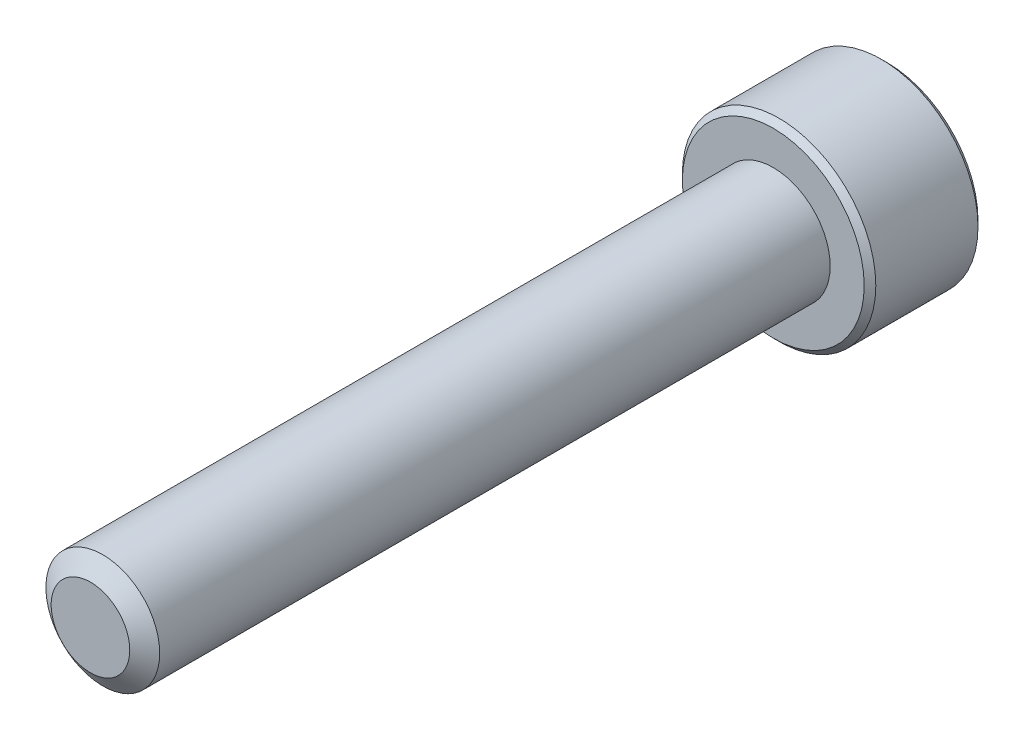
ISO-10303-21;
HEADER;
FILE_DESCRIPTION(('STEP AP214'),'2;1');
FILE_NAME('part.step','',(''),(''),'','','');
FILE_SCHEMA(('AUTOMOTIVE_DESIGN { 1 0 10303 214 1 1 1 1 }'));
ENDSEC;
DATA;
#1=APPLICATION_CONTEXT('core data for automotive mechanical design processes');
#2=APPLICATION_PROTOCOL_DEFINITION('international standard','automotive_design',2000,#1);
#3=PRODUCT_CONTEXT('',#1,'mechanical');
#4=PRODUCT('Part','Part','',(#3));
#5=PRODUCT_RELATED_PRODUCT_CATEGORY('part','',(#4));
#6=PRODUCT_DEFINITION_FORMATION('','',#4);
#7=PRODUCT_DEFINITION_CONTEXT('part definition',#1,'design');
#8=PRODUCT_DEFINITION('design','',#6,#7);
#9=PRODUCT_DEFINITION_SHAPE('','',#8);
#10=(LENGTH_UNIT() NAMED_UNIT(*) SI_UNIT(.MILLI.,.METRE.));
#11=(NAMED_UNIT(*) PLANE_ANGLE_UNIT() SI_UNIT($,.RADIAN.));
#12=(NAMED_UNIT(*) SI_UNIT($,.STERADIAN.) SOLID_ANGLE_UNIT());
#13=UNCERTAINTY_MEASURE_WITH_UNIT(LENGTH_MEASURE(1.E-05),#10,'distance_accuracy_value','');
#14=(GEOMETRIC_REPRESENTATION_CONTEXT(3) GLOBAL_UNCERTAINTY_ASSIGNED_CONTEXT((#13)) GLOBAL_UNIT_ASSIGNED_CONTEXT((#10,
#11,#12)) REPRESENTATION_CONTEXT('',''));
#15=CARTESIAN_POINT('',(0.,0.,0.));
#16=DIRECTION('',(0.,0.,1.));
#17=DIRECTION('',(1.,0.,0.));
#18=AXIS2_PLACEMENT_3D('',#15,#16,#17);
#19=CARTESIAN_POINT('',(-3.1112265541644E-12,0.,-30.));
#20=DIRECTION('',(0.,0.,1.));
#21=DIRECTION('',(1.,0.,0.));
#22=AXIS2_PLACEMENT_3D('',#19,#20,#21);
#23=CYLINDRICAL_SURFACE('',#22,2.5);
#24=CARTESIAN_POINT('',(0.,0.,-0.541691224311858));
#25=DIRECTION('',(0.,0.,1.));
#26=DIRECTION('',(1.,0.,0.));
#27=AXIS2_PLACEMENT_3D('',#24,#25,#26);
#28=CIRCLE('',#27,2.5);
#29=CARTESIAN_POINT('',(2.5,0.,-0.541691224311858));
#30=VERTEX_POINT('',#29);
#31=EDGE_CURVE('E122',#30,#30,#28,.T.);
#32=ORIENTED_EDGE('',*,*,#31,.F.);
#33=EDGE_LOOP('',(#32));
#34=FACE_BOUND('',#33,.T.);
#35=CARTESIAN_POINT('',(-3.1112265541644E-12,0.,-30.));
#36=DIRECTION('',(0.,0.,-1.));
#37=DIRECTION('',(-1.,0.,0.));
#38=AXIS2_PLACEMENT_3D('',#35,#36,#37);
#39=CIRCLE('',#38,2.5);
#40=CARTESIAN_POINT('',(-2.50000000000311,0.,-30.));
#41=VERTEX_POINT('',#40);
#42=EDGE_CURVE('E228',#41,#41,#39,.F.);
#43=ORIENTED_EDGE('',*,*,#42,.T.);
#44=EDGE_LOOP('',(#43));
#45=FACE_BOUND('',#44,.T.);
#46=ADVANCED_FACE('F48',(#34,#45),#23,.T.);
#47=CARTESIAN_POINT('',(0.,0.,0.));
#48=DIRECTION('',(0.,0.,-1.));
#49=DIRECTION('',(-1.,0.,0.));
#50=AXIS2_PLACEMENT_3D('',#47,#48,#49);
#51=CONICAL_SURFACE('',#50,1.72638475772933,0.959931088596884);
#52=ORIENTED_EDGE('',*,*,#31,.T.);
#53=EDGE_LOOP('',(#52));
#54=FACE_BOUND('',#53,.T.);
#55=CARTESIAN_POINT('',(0.,0.,0.));
#56=DIRECTION('',(0.,0.,1.));
#57=DIRECTION('',(1.,0.,0.));
#58=AXIS2_PLACEMENT_3D('',#55,#56,#57);
#59=CIRCLE('',#58,1.72638475772933);
#60=CARTESIAN_POINT('',(1.72638475772933,0.,0.));
#61=VERTEX_POINT('',#60);
#62=EDGE_CURVE('E226',#61,#61,#59,.T.);
#63=ORIENTED_EDGE('',*,*,#62,.F.);
#64=EDGE_LOOP('',(#63));
#65=FACE_BOUND('',#64,.T.);
#66=ADVANCED_FACE('F209',(#54,#65),#51,.T.);
#67=CARTESIAN_POINT('',(0.,0.,0.));
#68=DIRECTION('',(0.,0.,1.));
#69=DIRECTION('',(1.,0.,0.));
#70=AXIS2_PLACEMENT_3D('',#67,#68,#69);
#71=PLANE('',#70);
#72=ORIENTED_EDGE('',*,*,#62,.T.);
#73=EDGE_LOOP('',(#72));
#74=FACE_BOUND('',#73,.T.);
#75=ADVANCED_FACE('F206',(#74),#71,.T.);
#76=CARTESIAN_POINT('',(-3.10862446895044E-12,0.,-35.));
#77=DIRECTION('',(0.,0.,1.));
#78=DIRECTION('',(1.,0.,0.));
#79=AXIS2_PLACEMENT_3D('',#76,#77,#78);
#80=CYLINDRICAL_SURFACE('',#79,4.25);
#81=CARTESIAN_POINT('',(-3.10862446895044E-12,0.,-34.745));
#82=DIRECTION('',(0.,0.,-1.));
#83=DIRECTION('',(-1.,0.,0.));
#84=AXIS2_PLACEMENT_3D('',#81,#82,#83);
#85=CIRCLE('',#84,4.25);
#86=CARTESIAN_POINT('',(-4.25000000000311,0.,-34.745));
#87=VERTEX_POINT('',#86);
#88=EDGE_CURVE('E56',#87,#87,#85,.F.);
#89=ORIENTED_EDGE('',*,*,#88,.T.);
#90=EDGE_LOOP('',(#89));
#91=FACE_BOUND('',#90,.T.);
#92=CARTESIAN_POINT('',(-3.1112265541644E-12,0.,-30.255));
#93=DIRECTION('',(0.,0.,-1.));
#94=DIRECTION('',(-1.,0.,0.));
#95=AXIS2_PLACEMENT_3D('',#92,#93,#94);
#96=CIRCLE('',#95,4.25);
#97=CARTESIAN_POINT('',(-4.25000000000311,0.,-30.255));
#98=VERTEX_POINT('',#97);
#99=EDGE_CURVE('E185',#98,#98,#96,.T.);
#100=ORIENTED_EDGE('',*,*,#99,.T.);
#101=EDGE_LOOP('',(#100));
#102=FACE_BOUND('',#101,.T.);
#103=ADVANCED_FACE('F190',(#91,#102),#80,.T.);
#104=CARTESIAN_POINT('',(-3.10862446895044E-12,0.,-35.));
#105=DIRECTION('',(0.,0.,-1.));
#106=DIRECTION('',(-1.,0.,0.));
#107=AXIS2_PLACEMENT_3D('',#104,#105,#106);
#108=PLANE('',#107);
#109=CARTESIAN_POINT('',(-3.10862446895044E-12,0.,-35.));
#110=DIRECTION('',(0.,0.,-1.));
#111=DIRECTION('',(-1.,0.,0.));
#112=AXIS2_PLACEMENT_3D('',#109,#110,#111);
#113=CIRCLE('',#112,3.99500000000001);
#114=CARTESIAN_POINT('',(-3.99500000000311,0.,-35.));
#115=VERTEX_POINT('',#114);
#116=EDGE_CURVE('E121',#115,#115,#113,.T.);
#117=ORIENTED_EDGE('',*,*,#116,.T.);
#118=EDGE_LOOP('',(#117));
#119=FACE_BOUND('',#118,.T.);
#120=CARTESIAN_POINT('',(-3.10862446895044E-12,0.,-35.));
#121=DIRECTION('',(0.,0.,-1.));
#122=DIRECTION('',(-1.,0.,0.));
#123=AXIS2_PLACEMENT_3D('',#120,#121,#122);
#124=CIRCLE('',#123,2.3094010767585);
#125=CARTESIAN_POINT('',(-2.00000000000311,1.15470053837919,-35.));
#126=VERTEX_POINT('',#125);
#127=CARTESIAN_POINT('',(-3.1112265541644E-12,2.30940107675859,-35.));
#128=VERTEX_POINT('',#127);
#129=EDGE_CURVE('E102',#126,#128,#124,.T.);
#130=ORIENTED_EDGE('',*,*,#129,.F.);
#131=CARTESIAN_POINT('',(-2.00000000000311,-1.15470053837918,-35.));
#132=VERTEX_POINT('',#131);
#133=EDGE_CURVE('E62',#132,#126,#124,.T.);
#134=ORIENTED_EDGE('',*,*,#133,.F.);
#135=CARTESIAN_POINT('',(-3.10862446895044E-12,-2.30940107675859,-35.));
#136=VERTEX_POINT('',#135);
#137=EDGE_CURVE('E288',#136,#132,#124,.T.);
#138=ORIENTED_EDGE('',*,*,#137,.F.);
#139=CARTESIAN_POINT('',(1.99999999999689,-1.15470053837918,-35.));
#140=VERTEX_POINT('',#139);
#141=EDGE_CURVE('E69',#140,#136,#124,.T.);
#142=ORIENTED_EDGE('',*,*,#141,.F.);
#143=CARTESIAN_POINT('',(1.99999999999689,1.15470053837918,-35.));
#144=VERTEX_POINT('',#143);
#145=EDGE_CURVE('E143',#144,#140,#124,.T.);
#146=ORIENTED_EDGE('',*,*,#145,.F.);
#147=EDGE_CURVE('E111',#128,#144,#124,.T.);
#148=ORIENTED_EDGE('',*,*,#147,.F.);
#149=EDGE_LOOP('',(#130,#134,#138,#142,#146,#148));
#150=FACE_BOUND('',#149,.T.);
#151=ADVANCED_FACE('F142',(#119,#150),#108,.T.);
#152=CARTESIAN_POINT('',(-3.1112265541644E-12,0.,-30.));
#153=DIRECTION('',(0.,0.,-1.));
#154=DIRECTION('',(-1.,0.,0.));
#155=AXIS2_PLACEMENT_3D('',#152,#153,#154);
#156=PLANE('',#155);
#157=CARTESIAN_POINT('',(-3.1112265541644E-12,0.,-30.));
#158=DIRECTION('',(0.,0.,-1.));
#159=DIRECTION('',(-1.,0.,0.));
#160=AXIS2_PLACEMENT_3D('',#157,#158,#159);
#161=CIRCLE('',#160,3.995);
#162=CARTESIAN_POINT('',(-3.99500000000311,0.,-30.));
#163=VERTEX_POINT('',#162);
#164=EDGE_CURVE('E13',#163,#163,#161,.F.);
#165=ORIENTED_EDGE('',*,*,#164,.T.);
#166=EDGE_LOOP('',(#165));
#167=FACE_BOUND('',#166,.T.);
#168=ORIENTED_EDGE('',*,*,#42,.F.);
#169=EDGE_LOOP('',(#168));
#170=FACE_BOUND('',#169,.T.);
#171=ADVANCED_FACE('F199',(#167,#170),#156,.F.);
#172=CARTESIAN_POINT('',(-3.10862446895044E-12,0.,-35.));
#173=DIRECTION('',(0.,0.,-1.));
#174=DIRECTION('',(-1.,0.,0.));
#175=AXIS2_PLACEMENT_3D('',#172,#173,#174);
#176=CONICAL_SURFACE('',#175,2.3094010767585,0.78539816339745);
#177=ORIENTED_EDGE('',*,*,#147,.T.);
#178=CARTESIAN_POINT('',(-0.000200000003116978,2.30951654681233,-35.0001154787137));
#179=CARTESIAN_POINT('',(0.0685530340276287,2.26982196410715,-34.9604530902256));
#180=CARTESIAN_POINT('',(0.138455742132447,2.22946361676577,-34.9231199822842));
#181=CARTESIAN_POINT('',(0.280995244547385,2.14716839667636,-34.8547636851362));
#182=CARTESIAN_POINT('',(0.353645597562306,2.10522369580646,-34.8237785337373));
#183=CARTESIAN_POINT('',(0.500141601050941,2.02064418875711,-34.7707002165442));
#184=CARTESIAN_POINT('',(0.573949935243285,1.97803092714276,-34.7484736271767));
#185=CARTESIAN_POINT('',(0.723191631832215,1.89186619344273,-34.7142288166751));
#186=CARTESIAN_POINT('',(0.798620433915042,1.84831735425541,-34.7021850291441));
#187=CARTESIAN_POINT('',(0.928615500667985,1.77326466747232,-34.6913185119056));
#188=CARTESIAN_POINT('',(0.983013783967055,1.74185780396626,-34.68970975361));
#189=CARTESIAN_POINT('',(1.09172145551666,1.6790954005342,-34.6924188775988));
#190=CARTESIAN_POINT('',(1.14603080591829,1.64773988246027,-34.696738837758));
#191=CARTESIAN_POINT('',(1.25413672758627,1.58532489948425,-34.71105956741));
#192=CARTESIAN_POINT('',(1.30793265655172,1.55426580541475,-34.7210666927621));
#193=CARTESIAN_POINT('',(1.4145942623025,1.49268469862235,-34.7462124302497));
#194=CARTESIAN_POINT('',(1.46746001006764,1.46216264491925,-34.7613506490423));
#195=CARTESIAN_POINT('',(1.60287973308677,1.38397803138057,-34.8062945034292));
#196=CARTESIAN_POINT('',(1.68459383484639,1.33680037273304,-34.8394888394258));
#197=CARTESIAN_POINT('',(1.80474703725472,1.2674298889786,-34.8955258231714));
#198=CARTESIAN_POINT('',(1.84434285210609,1.24456923461538,-34.915214702947));
#199=CARTESIAN_POINT('',(1.92280095888479,1.19927142554659,-34.9563873183649));
#200=CARTESIAN_POINT('',(1.96166368359065,1.1768340209762,-34.9778699516513));
#201=CARTESIAN_POINT('',(2.0001999999969,1.15458506832544,-35.0001154787137));
#202=B_SPLINE_CURVE_WITH_KNOTS('',3,(#178,#179,#180,#181,#182,#183,#184,#185,#186,#187,#188,
#189,#190,#191,#192,#193,#194,#195,#196,#197,#198,#199,#200,#201),.UNSPECIFIED.,.F.,.F.,(4,2,2,
2,2,2,2,2,2,2,2,4),(0.,0.266420613771073,0.534393751523417,0.798110374376957,1.06116288956941,
1.24939906803724,1.43770123566248,1.62621426093931,1.8147128383191,2.11415604834142,
2.26347170717788,2.41269626969768),.UNSPECIFIED.);
#203=EDGE_CURVE('E116',#128,#144,#202,.T.);
#204=ORIENTED_EDGE('',*,*,#203,.F.);
#205=EDGE_LOOP('',(#177,#204));
#206=FACE_BOUND('',#205,.T.);
#207=ADVANCED_FACE('F117',(#206),#176,.F.);
#208=ORIENTED_EDGE('',*,*,#145,.T.);
#209=CARTESIAN_POINT('',(1.99999999999689,-2.3029441729292,-35.7407713550277));
#210=CARTESIAN_POINT('',(1.99999999999689,-2.24687002663711,-35.698443273626));
#211=CARTESIAN_POINT('',(1.99999999999689,-2.19048190536959,-35.6565251568643));
#212=CARTESIAN_POINT('',(1.99999999999689,-2.07695390496425,-35.573690417861));
#213=CARTESIAN_POINT('',(1.99999999999689,-2.01981384066455,-35.5327740496681));
#214=CARTESIAN_POINT('',(1.99999999999689,-1.90424016804777,-35.4518334520186));
#215=CARTESIAN_POINT('',(1.99999999999689,-1.84579996743912,-35.4118185915599));
#216=CARTESIAN_POINT('',(1.99999999999689,-1.72792745461763,-35.3332889936643));
#217=CARTESIAN_POINT('',(1.99999999999689,-1.66849521292327,-35.2947741502431));
#218=CARTESIAN_POINT('',(1.99999999999689,-1.48162995710024,-35.1776406516043));
#219=CARTESIAN_POINT('',(1.99999999999689,-1.3522031816354,-35.1021459017296));
#220=CARTESIAN_POINT('',(1.99999999999689,-1.0868952159293,-34.9640493509944));
#221=CARTESIAN_POINT('',(1.99999999999689,-0.951037763938266,-34.9014040859035));
#222=CARTESIAN_POINT('',(1.99999999999689,-0.747111912259486,-34.8247635438751));
#223=CARTESIAN_POINT('',(1.99999999999689,-0.682064034147949,-34.8027671799191));
#224=CARTESIAN_POINT('',(1.99999999999689,-0.55039810329482,-34.7639966876601));
#225=CARTESIAN_POINT('',(1.99999999999689,-0.483779942722543,-34.7472229191212));
#226=CARTESIAN_POINT('',(1.99999999999689,-0.35048432884772,-34.7200482578844));
#227=CARTESIAN_POINT('',(1.99999999999689,-0.283829489364849,-34.7095381767417));
#228=CARTESIAN_POINT('',(1.99999999999689,-0.149806987139437,-34.6950960855449));
#229=CARTESIAN_POINT('',(1.99999999999689,-0.0824394489341806,-34.6911629447331));
#230=CARTESIAN_POINT('',(1.99999999999689,0.0499055622944297,-34.6901664769337));
#231=CARTESIAN_POINT('',(1.99999999999689,0.114881285143109,-34.6928596448504));
#232=CARTESIAN_POINT('',(1.99999999999689,0.24427592148269,-34.7044300704227));
#233=CARTESIAN_POINT('',(1.99999999999689,0.308694780266678,-34.7133079288332));
#234=CARTESIAN_POINT('',(1.99999999999689,0.437599788610625,-34.7369136592961));
#235=CARTESIAN_POINT('',(1.99999999999689,0.502067428644516,-34.7517410834465));
#236=CARTESIAN_POINT('',(1.99999999999689,0.629594322598215,-34.7864578836279));
#237=CARTESIAN_POINT('',(1.99999999999689,0.692653693883047,-34.8063468361063));
#238=CARTESIAN_POINT('',(1.99999999999689,0.89118788921044,-34.8764469792562));
#239=CARTESIAN_POINT('',(1.99999999999689,1.023835457073,-34.9346418003215));
#240=CARTESIAN_POINT('',(1.99999999999689,1.28290932150071,-35.0640305754595));
#241=CARTESIAN_POINT('',(1.99999999999689,1.40931112587568,-35.1352712314148));
#242=CARTESIAN_POINT('',(1.99999999999689,1.59200441438961,-35.2464419918747));
#243=CARTESIAN_POINT('',(1.99999999999689,1.65027549026189,-35.2831821903373));
#244=CARTESIAN_POINT('',(1.99999999999689,1.76581760389241,-35.3582145141837));
#245=CARTESIAN_POINT('',(1.99999999999689,1.82308856543103,-35.396506757118));
#246=CARTESIAN_POINT('',(1.99999999999689,1.93629654762083,-35.4740422640812));
#247=CARTESIAN_POINT('',(1.99999999999689,1.99224062500538,-35.5132752761335));
#248=CARTESIAN_POINT('',(1.99999999999689,2.103364240299,-35.5927788307365));
#249=CARTESIAN_POINT('',(1.99999999999689,2.15854398422468,-35.6330490850006));
#250=CARTESIAN_POINT('',(1.99999999999689,2.21340370692658,-35.673744238146));
#251=B_SPLINE_CURVE_WITH_KNOTS('',3,(#209,#210,#211,#212,#213,#214,#215,#216,#217,#218,#219,
#220,#221,#222,#223,#224,#225,#226,#227,#228,#229,#230,#231,#232,#233,#234,#235,#236,#237,#238,
#239,#240,#241,#242,#243,#244,#245,#246,#247,#248,#249,#250),.UNSPECIFIED.,.F.,.F.,(4,2,2,2,2,2,
2,2,2,2,2,2,2,2,2,2,2,2,2,2,4),(0.,0.210772731976881,0.421598374658567,0.634057554623456,
0.846501695870126,1.29562155455618,1.74319622821637,1.949020621102,2.15485918928318,
2.35699582502629,2.55909770432134,2.75388435553549,2.94868993014806,3.14690093452576,
3.34509535789692,3.77838155837647,4.21325029921621,4.41989056685643,4.62654651460918,
4.83152377111288,5.03644465914085),.UNSPECIFIED.);
#252=EDGE_CURVE('E110',#144,#140,#251,.F.);
#253=ORIENTED_EDGE('',*,*,#252,.F.);
#254=EDGE_LOOP('',(#208,#253));
#255=FACE_BOUND('',#254,.T.);
#256=ADVANCED_FACE('F294',(#255),#176,.F.);
#257=ORIENTED_EDGE('',*,*,#141,.T.);
#258=CARTESIAN_POINT('',(2.0001999999969,-1.15458506832544,-35.0001154787137));
#259=CARTESIAN_POINT('',(1.93144696596617,-1.19427965103061,-34.9604530902255));
#260=CARTESIAN_POINT('',(1.86154425786135,-1.23463799837199,-34.9231199822841));
#261=CARTESIAN_POINT('',(1.71900475544642,-1.3169332184614,-34.8547636851361));
#262=CARTESIAN_POINT('',(1.6463544024315,-1.3588779193313,-34.8237785337371));
#263=CARTESIAN_POINT('',(1.49985839894287,-1.44345742638064,-34.7707002165441));
#264=CARTESIAN_POINT('',(1.42605006475053,-1.48607068799498,-34.7484736271765));
#265=CARTESIAN_POINT('',(1.27680836816159,-1.57223542169503,-34.714228816675));
#266=CARTESIAN_POINT('',(1.20137956607875,-1.61578426088235,-34.7021850291442));
#267=CARTESIAN_POINT('',(1.0713844993258,-1.69083694766545,-34.6913185119056));
#268=CARTESIAN_POINT('',(1.01698621602673,-1.72224381117151,-34.6897097536099));
#269=CARTESIAN_POINT('',(0.908278544477123,-1.78500621460357,-34.6924188775986));
#270=CARTESIAN_POINT('',(0.8539691940755,-1.81636173267749,-34.6967388377579));
#271=CARTESIAN_POINT('',(0.745863272407523,-1.87877671565351,-34.7110595674098));
#272=CARTESIAN_POINT('',(0.692067343442069,-1.90983580972301,-34.7210666927619));
#273=CARTESIAN_POINT('',(0.585405737691313,-1.97141691651541,-34.7462124302496));
#274=CARTESIAN_POINT('',(0.532539989926198,-2.00193897021852,-34.7613506490422));
#275=CARTESIAN_POINT('',(0.397120266907072,-2.08012358375721,-34.8062945034292));
#276=CARTESIAN_POINT('',(0.315406165147396,-2.12730124240473,-34.8394888394258));
#277=CARTESIAN_POINT('',(0.195252962739043,-2.19667172615918,-34.8955258231713));
#278=CARTESIAN_POINT('',(0.155657147887665,-2.2195323805224,-34.9152147029469));
#279=CARTESIAN_POINT('',(0.0771990411089778,-2.2648301895912,-34.9563873183648));
#280=CARTESIAN_POINT('',(0.0383363164031208,-2.28726759416158,-34.9778699516512));
#281=CARTESIAN_POINT('',(-0.000200000003114376,-2.30951654681233,-35.0001154787137));
#282=B_SPLINE_CURVE_WITH_KNOTS('',3,(#258,#259,#260,#261,#262,#263,#264,#265,#266,#267,#268,
#269,#270,#271,#272,#273,#274,#275,#276,#277,#278,#279,#280,#281),.UNSPECIFIED.,.F.,.F.,(4,2,2,
2,2,2,2,2,2,2,2,4),(0.,0.266420613771111,0.534393751523434,0.798110374376966,1.06116288956945,
1.24939906803728,1.43770123566251,1.62621426093932,1.81471283831912,2.11415604834147,
2.26347170717794,2.41269626969776),.UNSPECIFIED.);
#283=EDGE_CURVE('E153',#140,#136,#282,.T.);
#284=ORIENTED_EDGE('',*,*,#283,.F.);
#285=EDGE_LOOP('',(#257,#284));
#286=FACE_BOUND('',#285,.T.);
#287=ADVANCED_FACE('F291',(#286),#176,.F.);
#288=ORIENTED_EDGE('',*,*,#137,.T.);
#289=CARTESIAN_POINT('',(0.000199999996897127,-2.30951654681233,-35.0001154787137));
#290=CARTESIAN_POINT('',(-0.0685530340338496,-2.26982196410715,-34.9604530902256));
#291=CARTESIAN_POINT('',(-0.138455742138667,-2.22946361676577,-34.9231199822842));
#292=CARTESIAN_POINT('',(-0.280995244553601,-2.14716839667636,-34.8547636851362));
#293=CARTESIAN_POINT('',(-0.353645597568521,-2.10522369580646,-34.8237785337373));
#294=CARTESIAN_POINT('',(-0.500141601057155,-2.02064418875712,-34.7707002165442));
#295=CARTESIAN_POINT('',(-0.573949935249501,-1.97803092714277,-34.7484736271767));
#296=CARTESIAN_POINT('',(-0.723191631838432,-1.89186619344273,-34.7142288166751));
#297=CARTESIAN_POINT('',(-0.798620433921257,-1.84831735425541,-34.7021850291441));
#298=CARTESIAN_POINT('',(-0.928615500674207,-1.77326466747232,-34.6913185119056));
#299=CARTESIAN_POINT('',(-0.983013783973283,-1.74185780396626,-34.68970975361));
#300=CARTESIAN_POINT('',(-1.0917214555229,-1.67909540053419,-34.6924188775988));
#301=CARTESIAN_POINT('',(-1.14603080592452,-1.64773988246025,-34.696738837758));
#302=CARTESIAN_POINT('',(-1.25413672759252,-1.58532489948425,-34.71105956741));
#303=CARTESIAN_POINT('',(-1.30793265655799,-1.55426580541477,-34.7210666927621));
#304=CARTESIAN_POINT('',(-1.41459426230873,-1.49268469862229,-34.7462124302497));
#305=CARTESIAN_POINT('',(-1.46746001007381,-1.46216264491907,-34.7613506490423));
#306=CARTESIAN_POINT('',(-1.6028797330929,-1.38397803138033,-34.8062945034292));
#307=CARTESIAN_POINT('',(-1.68459383485261,-1.33680037273298,-34.8394888394258));
#308=CARTESIAN_POINT('',(-1.80474703726096,-1.26742988897862,-34.8955258231714));
#309=CARTESIAN_POINT('',(-1.84434285211233,-1.24456923461539,-34.915214702947));
#310=CARTESIAN_POINT('',(-1.92280095889101,-1.19927142554657,-34.9563873183649));
#311=CARTESIAN_POINT('',(-1.96166368359686,-1.17683402097617,-34.9778699516513));
#312=CARTESIAN_POINT('',(-2.00020000000312,-1.15458506832544,-35.0001154787137));
#313=B_SPLINE_CURVE_WITH_KNOTS('',3,(#289,#290,#291,#292,#293,#294,#295,#296,#297,#298,#299,
#300,#301,#302,#303,#304,#305,#306,#307,#308,#309,#310,#311,#312),.UNSPECIFIED.,.F.,.F.,(4,2,2,
2,2,2,2,2,2,2,2,4),(0.,0.266420613771067,0.534393751523411,0.798110374376953,1.06116288956941,
1.24939906803726,1.43770123566251,1.62621426093935,1.81471283831915,2.11415604834144,
2.26347170717789,2.41269626969769),.UNSPECIFIED.);
#314=EDGE_CURVE('E265',#136,#132,#313,.T.);
#315=ORIENTED_EDGE('',*,*,#314,.F.);
#316=EDGE_LOOP('',(#288,#315));
#317=FACE_BOUND('',#316,.T.);
#318=ADVANCED_FACE('F290',(#317),#176,.F.);
#319=ORIENTED_EDGE('',*,*,#133,.T.);
#320=CARTESIAN_POINT('',(-2.00000000000311,-2.30294417326426,-35.7407713552807));
#321=CARTESIAN_POINT('',(-2.00000000000311,-2.24687002696276,-35.6984432738692));
#322=CARTESIAN_POINT('',(-2.00000000000311,-2.19048190568581,-35.6565251570978));
#323=CARTESIAN_POINT('',(-2.00000000000311,-2.07695390526151,-35.5736904180751));
#324=CARTESIAN_POINT('',(-2.00000000000311,-2.01981384095228,-35.5327740498725));
#325=CARTESIAN_POINT('',(-2.00000000000311,-1.90424016831613,-35.4518334522036));
#326=CARTESIAN_POINT('',(-2.00000000000311,-1.84579996769762,-35.4118185917351));
#327=CARTESIAN_POINT('',(-2.00000000000311,-1.72792745485625,-35.3332889938202));
#328=CARTESIAN_POINT('',(-2.00000000000311,-1.66849521315186,-35.2947741503895));
#329=CARTESIAN_POINT('',(-2.00000000000311,-1.48162995729575,-35.1776406517203));
#330=CARTESIAN_POINT('',(-2.00000000000311,-1.35220318180739,-35.1021459018253));
#331=CARTESIAN_POINT('',(-2.00000000000311,-1.08689521605224,-34.9640493510523));
#332=CARTESIAN_POINT('',(-2.00000000000311,-0.951037764035688,-34.901404085944));
#333=CARTESIAN_POINT('',(-2.00000000000311,-0.747111912337722,-34.8247635439028));
#334=CARTESIAN_POINT('',(-2.00000000000311,-0.682064034234229,-34.8027671799472));
#335=CARTESIAN_POINT('',(-2.00000000000311,-0.550398103397449,-34.7639966876876));
#336=CARTESIAN_POINT('',(-2.00000000000311,-0.483779942833476,-34.7472229191476));
#337=CARTESIAN_POINT('',(-2.00000000000311,-0.350484328974988,-34.7200482579067));
#338=CARTESIAN_POINT('',(-2.00000000000311,-0.283829489500144,-34.709538176761));
#339=CARTESIAN_POINT('',(-2.00000000000311,-0.149806987290515,-34.6950960855565));
#340=CARTESIAN_POINT('',(-2.00000000000311,-0.0824394490930139,-34.6911629447399));
#341=CARTESIAN_POINT('',(-2.00000000000311,0.0499055621213036,-34.6901664769296));
#342=CARTESIAN_POINT('',(-2.00000000000311,0.114881284963426,-34.6928596448403));
#343=CARTESIAN_POINT('',(-2.00000000000311,0.244275921290551,-34.7044300703995));
#344=CARTESIAN_POINT('',(-2.00000000000311,0.308694780068641,-34.7133079288031));
#345=CARTESIAN_POINT('',(-2.00000000000311,0.437599788400937,-34.7369136592514));
#346=CARTESIAN_POINT('',(-2.00000000000311,0.502067428429092,-34.7517410833941));
#347=CARTESIAN_POINT('',(-2.00000000000311,0.629594322371892,-34.78645788356));
#348=CARTESIAN_POINT('',(-2.00000000000311,0.69265369365156,-34.8063468360305));
#349=CARTESIAN_POINT('',(-2.00000000000311,0.891187888928516,-34.8764469791434));
#350=CARTESIAN_POINT('',(-2.00000000000311,1.02383545674829,-34.9346418001746));
#351=CARTESIAN_POINT('',(-2.00000000000311,1.28290932109378,-35.0640305752408));
#352=CARTESIAN_POINT('',(-2.00000000000311,1.40931112542931,-35.1352712311583));
#353=CARTESIAN_POINT('',(-2.00000000000311,1.59200441388852,-35.2464419915627));
#354=CARTESIAN_POINT('',(-2.00000000000311,1.65027548974479,-35.2831821900083));
#355=CARTESIAN_POINT('',(-2.00000000000311,1.76581760334351,-35.3582145138205));
#356=CARTESIAN_POINT('',(-2.00000000000311,1.82308856486635,-35.3965067567376));
#357=CARTESIAN_POINT('',(-2.00000000000311,1.93629654702497,-35.4740422636668));
#358=CARTESIAN_POINT('',(-2.00000000000311,1.99224062439411,-35.5132752757022));
#359=CARTESIAN_POINT('',(-2.00000000000311,2.10336423965701,-35.5927788302713));
#360=CARTESIAN_POINT('',(-2.00000000000311,2.15854398356739,-35.6330490845184));
#361=CARTESIAN_POINT('',(-2.00000000000311,2.21340370625401,-35.6737442376469));
#362=B_SPLINE_CURVE_WITH_KNOTS('',3,(#320,#321,#322,#323,#324,#325,#326,#327,#328,#329,#330,
#331,#332,#333,#334,#335,#336,#337,#338,#339,#340,#341,#342,#343,#344,#345,#346,#347,#348,#349,
#350,#351,#352,#353,#354,#355,#356,#357,#358,#359,#360,#361),.UNSPECIFIED.,.F.,.F.,(4,2,2,2,2,2,
2,2,2,2,2,2,2,2,2,2,2,2,2,2,4),(0.,0.210772732017002,0.421598374738827,0.634057554744603,
0.846501696032152,1.29562155480986,1.74319622856086,1.94902062142324,2.15485918958121,
2.35699582530205,2.55909770457484,2.75388435576867,2.9486899303609,3.14690093471669,
3.34509535806595,3.7783815583877,4.21325029906862,4.41989056664092,4.62654651432573,
4.83152377076241,5.03644465872337),.UNSPECIFIED.);
#363=EDGE_CURVE('E132',#132,#126,#362,.T.);
#364=ORIENTED_EDGE('',*,*,#363,.F.);
#365=EDGE_LOOP('',(#319,#364));
#366=FACE_BOUND('',#365,.T.);
#367=ADVANCED_FACE('F303',(#366),#176,.F.);
#368=ORIENTED_EDGE('',*,*,#129,.T.);
#369=CARTESIAN_POINT('',(-2.00020000000312,1.15458506832545,-35.0001154787137));
#370=CARTESIAN_POINT('',(-1.93144696597239,1.19427965103062,-34.9604530902255));
#371=CARTESIAN_POINT('',(-1.86154425786757,1.234637998372,-34.9231199822841));
#372=CARTESIAN_POINT('',(-1.71900475545264,1.31693321846141,-34.8547636851361));
#373=CARTESIAN_POINT('',(-1.64635440243772,1.3588779193313,-34.8237785337372));
#374=CARTESIAN_POINT('',(-1.4998583989491,1.44345742638064,-34.7707002165441));
#375=CARTESIAN_POINT('',(-1.42605006475676,1.48607068799499,-34.7484736271765));
#376=CARTESIAN_POINT('',(-1.27680836816782,1.57223542169503,-34.714228816675));
#377=CARTESIAN_POINT('',(-1.20137956608497,1.61578426088234,-34.7021850291442));
#378=CARTESIAN_POINT('',(-1.07138449933201,1.69083694766544,-34.6913185119056));
#379=CARTESIAN_POINT('',(-1.01698621603294,1.72224381117151,-34.6897097536099));
#380=CARTESIAN_POINT('',(-0.908278544483336,1.78500621460359,-34.6924188775986));
#381=CARTESIAN_POINT('',(-0.853969194081706,1.8163617326775,-34.6967388377579));
#382=CARTESIAN_POINT('',(-0.745863272413724,1.87877671565353,-34.7110595674098));
#383=CARTESIAN_POINT('',(-0.692067343448272,1.90983580972304,-34.7210666927619));
#384=CARTESIAN_POINT('',(-0.585405737697499,1.97141691651543,-34.7462124302496));
#385=CARTESIAN_POINT('',(-0.532539989932367,2.00193897021852,-34.7613506490422));
#386=CARTESIAN_POINT('',(-0.397120266913237,2.08012358375719,-34.8062945034292));
#387=CARTESIAN_POINT('',(-0.315406165153589,2.12730124240474,-34.8394888394258));
#388=CARTESIAN_POINT('',(-0.195252962745253,2.19667172615919,-34.8955258231713));
#389=CARTESIAN_POINT('',(-0.155657147893877,2.21953238052241,-34.9152147029469));
#390=CARTESIAN_POINT('',(-0.0771990411151923,2.2648301895912,-34.9563873183648));
#391=CARTESIAN_POINT('',(-0.0383363164093364,2.28726759416158,-34.9778699516512));
#392=CARTESIAN_POINT('',(0.000199999996894525,2.30951654681233,-35.0001154787137));
#393=B_SPLINE_CURVE_WITH_KNOTS('',3,(#369,#370,#371,#372,#373,#374,#375,#376,#377,#378,#379,
#380,#381,#382,#383,#384,#385,#386,#387,#388,#389,#390,#391,#392),.UNSPECIFIED.,.F.,.F.,(4,2,2,
2,2,2,2,2,2,2,2,4),(0.,0.266420613771103,0.534393751523425,0.798110374376956,1.06116288956943,
1.24939906803728,1.43770123566253,1.62621426093935,1.81471283831916,2.11415604834149,
2.26347170717794,2.41269626969775),.UNSPECIFIED.);
#394=EDGE_CURVE('E106',#126,#128,#393,.T.);
#395=ORIENTED_EDGE('',*,*,#394,.F.);
#396=EDGE_LOOP('',(#368,#395));
#397=FACE_BOUND('',#396,.T.);
#398=ADVANCED_FACE('F104',(#397),#176,.F.);
#399=CARTESIAN_POINT('',(1.99999999999689,3.46410161513777,-32.));
#400=DIRECTION('',(0.,0.,-1.));
#401=DIRECTION('',(-1.,0.,0.));
#402=AXIS2_PLACEMENT_3D('',#399,#400,#401);
#403=PLANE('',#402);
#404=DIRECTION('',(0.866025403784439,0.5,0.));
#405=VECTOR('',#404,1.);
#406=CARTESIAN_POINT('',(-2.00000000000311,1.15470053837919,-32.));
#407=LINE('',#406,#405);
#408=CARTESIAN_POINT('',(-2.00000000000311,1.15470053837919,-32.));
#409=VERTEX_POINT('',#408);
#410=CARTESIAN_POINT('',(-3.1112265541644E-12,2.30940107675859,-32.));
#411=VERTEX_POINT('',#410);
#412=EDGE_CURVE('E131',#409,#411,#407,.T.);
#413=ORIENTED_EDGE('',*,*,#412,.T.);
#414=DIRECTION('',(0.866025403784439,-0.5,0.));
#415=VECTOR('',#414,1.);
#416=CARTESIAN_POINT('',(-3.1112265541644E-12,2.30940107675859,-32.));
#417=LINE('',#416,#415);
#418=CARTESIAN_POINT('',(1.99999999999689,1.15470053837918,-32.));
#419=VERTEX_POINT('',#418);
#420=EDGE_CURVE('E136',#411,#419,#417,.T.);
#421=ORIENTED_EDGE('',*,*,#420,.T.);
#422=DIRECTION('',(0.,-1.,0.));
#423=VECTOR('',#422,1.);
#424=CARTESIAN_POINT('',(1.99999999999689,1.15470053837918,-32.));
#425=LINE('',#424,#423);
#426=CARTESIAN_POINT('',(1.99999999999689,-1.15470053837918,-32.));
#427=VERTEX_POINT('',#426);
#428=EDGE_CURVE('E251',#419,#427,#425,.T.);
#429=ORIENTED_EDGE('',*,*,#428,.T.);
#430=DIRECTION('',(-0.866025403784439,-0.5,0.));
#431=VECTOR('',#430,1.);
#432=CARTESIAN_POINT('',(1.99999999999689,-1.15470053837918,-32.));
#433=LINE('',#432,#431);
#434=CARTESIAN_POINT('',(-3.10862446895044E-12,-2.30940107675859,-32.));
#435=VERTEX_POINT('',#434);
#436=EDGE_CURVE('E248',#427,#435,#433,.T.);
#437=ORIENTED_EDGE('',*,*,#436,.T.);
#438=DIRECTION('',(-0.866025403784439,0.5,0.));
#439=VECTOR('',#438,1.);
#440=CARTESIAN_POINT('',(-3.10862446895044E-12,-2.30940107675859,-32.));
#441=LINE('',#440,#439);
#442=CARTESIAN_POINT('',(-2.00000000000311,-1.15470053837918,-32.));
#443=VERTEX_POINT('',#442);
#444=EDGE_CURVE('E245',#435,#443,#441,.T.);
#445=ORIENTED_EDGE('',*,*,#444,.T.);
#446=DIRECTION('',(0.,1.,0.));
#447=VECTOR('',#446,1.);
#448=CARTESIAN_POINT('',(-2.00000000000311,-1.15470053837918,-32.));
#449=LINE('',#448,#447);
#450=EDGE_CURVE('E139',#443,#409,#449,.T.);
#451=ORIENTED_EDGE('',*,*,#450,.T.);
#452=EDGE_LOOP('',(#413,#421,#429,#437,#445,#451));
#453=FACE_BOUND('',#452,.T.);
#454=ADVANCED_FACE('F173',(#453),#403,.T.);
#455=CARTESIAN_POINT('',(-3.1112265541644E-12,2.30940107675859,-32.));
#456=DIRECTION('',(0.5,0.866025403784439,0.));
#457=DIRECTION('',(-0.866025403784439,0.5,0.));
#458=AXIS2_PLACEMENT_3D('',#455,#456,#457);
#459=PLANE('',#458);
#460=DIRECTION('',(0.,0.,-1.));
#461=VECTOR('',#460,1.);
#462=CARTESIAN_POINT('',(-3.1112265541644E-12,2.30940107675859,-32.));
#463=LINE('',#462,#461);
#464=EDGE_CURVE('E128',#411,#128,#463,.T.);
#465=ORIENTED_EDGE('',*,*,#464,.T.);
#466=ORIENTED_EDGE('',*,*,#203,.T.);
#467=DIRECTION('',(0.,0.,-1.));
#468=VECTOR('',#467,1.);
#469=CARTESIAN_POINT('',(1.99999999999689,1.15470053837918,-32.));
#470=LINE('',#469,#468);
#471=EDGE_CURVE('E138',#419,#144,#470,.T.);
#472=ORIENTED_EDGE('',*,*,#471,.F.);
#473=ORIENTED_EDGE('',*,*,#420,.F.);
#474=EDGE_LOOP('',(#465,#466,#472,#473));
#475=FACE_BOUND('',#474,.T.);
#476=ADVANCED_FACE('F134',(#475),#459,.F.);
#477=CARTESIAN_POINT('',(1.99999999999689,1.15470053837918,-32.));
#478=DIRECTION('',(1.,0.,0.));
#479=DIRECTION('',(0.,0.,-1.));
#480=AXIS2_PLACEMENT_3D('',#477,#478,#479);
#481=PLANE('',#480);
#482=ORIENTED_EDGE('',*,*,#471,.T.);
#483=ORIENTED_EDGE('',*,*,#252,.T.);
#484=DIRECTION('',(0.,0.,-1.));
#485=VECTOR('',#484,1.);
#486=CARTESIAN_POINT('',(1.99999999999689,-1.15470053837918,-32.));
#487=LINE('',#486,#485);
#488=EDGE_CURVE('E234',#427,#140,#487,.T.);
#489=ORIENTED_EDGE('',*,*,#488,.F.);
#490=ORIENTED_EDGE('',*,*,#428,.F.);
#491=EDGE_LOOP('',(#482,#483,#489,#490));
#492=FACE_BOUND('',#491,.T.);
#493=ADVANCED_FACE('F162',(#492),#481,.F.);
#494=CARTESIAN_POINT('',(1.99999999999689,-1.15470053837918,-32.));
#495=DIRECTION('',(0.5,-0.866025403784439,0.));
#496=DIRECTION('',(0.866025403784439,0.5,0.));
#497=AXIS2_PLACEMENT_3D('',#494,#495,#496);
#498=PLANE('',#497);
#499=ORIENTED_EDGE('',*,*,#488,.T.);
#500=ORIENTED_EDGE('',*,*,#283,.T.);
#501=DIRECTION('',(0.,0.,-1.));
#502=VECTOR('',#501,1.);
#503=CARTESIAN_POINT('',(-3.10862446895044E-12,-2.30940107675859,-32.));
#504=LINE('',#503,#502);
#505=EDGE_CURVE('E237',#435,#136,#504,.T.);
#506=ORIENTED_EDGE('',*,*,#505,.F.);
#507=ORIENTED_EDGE('',*,*,#436,.F.);
#508=EDGE_LOOP('',(#499,#500,#506,#507));
#509=FACE_BOUND('',#508,.T.);
#510=ADVANCED_FACE('F166',(#509),#498,.F.);
#511=CARTESIAN_POINT('',(-3.10862446895044E-12,-2.30940107675859,-32.));
#512=DIRECTION('',(-0.5,-0.866025403784439,0.));
#513=DIRECTION('',(0.866025403784439,-0.5,0.));
#514=AXIS2_PLACEMENT_3D('',#511,#512,#513);
#515=PLANE('',#514);
#516=ORIENTED_EDGE('',*,*,#505,.T.);
#517=ORIENTED_EDGE('',*,*,#314,.T.);
#518=DIRECTION('',(0.,0.,-1.));
#519=VECTOR('',#518,1.);
#520=CARTESIAN_POINT('',(-2.00000000000311,-1.15470053837918,-32.));
#521=LINE('',#520,#519);
#522=EDGE_CURVE('E240',#443,#132,#521,.T.);
#523=ORIENTED_EDGE('',*,*,#522,.F.);
#524=ORIENTED_EDGE('',*,*,#444,.F.);
#525=EDGE_LOOP('',(#516,#517,#523,#524));
#526=FACE_BOUND('',#525,.T.);
#527=ADVANCED_FACE('F273',(#526),#515,.F.);
#528=CARTESIAN_POINT('',(-2.00000000000311,-1.15470053837918,-32.));
#529=DIRECTION('',(-1.,0.,0.));
#530=DIRECTION('',(0.,-1.,0.));
#531=AXIS2_PLACEMENT_3D('',#528,#529,#530);
#532=PLANE('',#531);
#533=ORIENTED_EDGE('',*,*,#522,.T.);
#534=ORIENTED_EDGE('',*,*,#363,.T.);
#535=DIRECTION('',(0.,0.,-1.));
#536=VECTOR('',#535,1.);
#537=CARTESIAN_POINT('',(-2.00000000000311,1.15470053837919,-32.));
#538=LINE('',#537,#536);
#539=EDGE_CURVE('E130',#409,#126,#538,.T.);
#540=ORIENTED_EDGE('',*,*,#539,.F.);
#541=ORIENTED_EDGE('',*,*,#450,.F.);
#542=EDGE_LOOP('',(#533,#534,#540,#541));
#543=FACE_BOUND('',#542,.T.);
#544=ADVANCED_FACE('F270',(#543),#532,.F.);
#545=CARTESIAN_POINT('',(-2.00000000000311,1.15470053837919,-32.));
#546=DIRECTION('',(-0.5,0.866025403784439,0.));
#547=DIRECTION('',(-0.866025403784439,-0.5,0.));
#548=AXIS2_PLACEMENT_3D('',#545,#546,#547);
#549=PLANE('',#548);
#550=ORIENTED_EDGE('',*,*,#539,.T.);
#551=ORIENTED_EDGE('',*,*,#394,.T.);
#552=ORIENTED_EDGE('',*,*,#464,.F.);
#553=ORIENTED_EDGE('',*,*,#412,.F.);
#554=EDGE_LOOP('',(#550,#551,#552,#553));
#555=FACE_BOUND('',#554,.T.);
#556=ADVANCED_FACE('F126',(#555),#549,.F.);
#557=CARTESIAN_POINT('',(-3.10862446895044E-12,0.,-35.));
#558=DIRECTION('',(0.,0.,1.));
#559=DIRECTION('',(1.,0.,0.));
#560=AXIS2_PLACEMENT_3D('',#557,#558,#559);
#561=CONICAL_SURFACE('',#560,3.99500000000001,0.785398163397442);
#562=ORIENTED_EDGE('',*,*,#88,.F.);
#563=EDGE_LOOP('',(#562));
#564=FACE_BOUND('',#563,.T.);
#565=ORIENTED_EDGE('',*,*,#116,.F.);
#566=EDGE_LOOP('',(#565));
#567=FACE_BOUND('',#566,.T.);
#568=ADVANCED_FACE('F193',(#564,#567),#561,.T.);
#569=CARTESIAN_POINT('',(-3.1112265541644E-12,0.,-30.255));
#570=DIRECTION('',(0.,0.,-1.));
#571=DIRECTION('',(-1.,0.,0.));
#572=AXIS2_PLACEMENT_3D('',#569,#570,#571);
#573=CONICAL_SURFACE('',#572,4.25,0.785398163397455);
#574=ORIENTED_EDGE('',*,*,#164,.F.);
#575=EDGE_LOOP('',(#574));
#576=FACE_BOUND('',#575,.T.);
#577=ORIENTED_EDGE('',*,*,#99,.F.);
#578=EDGE_LOOP('',(#577));
#579=FACE_BOUND('',#578,.T.);
#580=ADVANCED_FACE('F50',(#576,#579),#573,.T.);
#581=CLOSED_SHELL('',(#46,#66,#75,#103,#151,#171,#207,#256,#287,#318,#367,#398,#454,#476,#493,
#510,#527,#544,#556,#568,#580));
#582=MANIFOLD_SOLID_BREP('B2',#581);
#583=ADVANCED_BREP_SHAPE_REPRESENTATION('',(#18,#582),#14);
#584=SHAPE_DEFINITION_REPRESENTATION(#9,#583);
ENDSEC;
END-ISO-10303-21;
